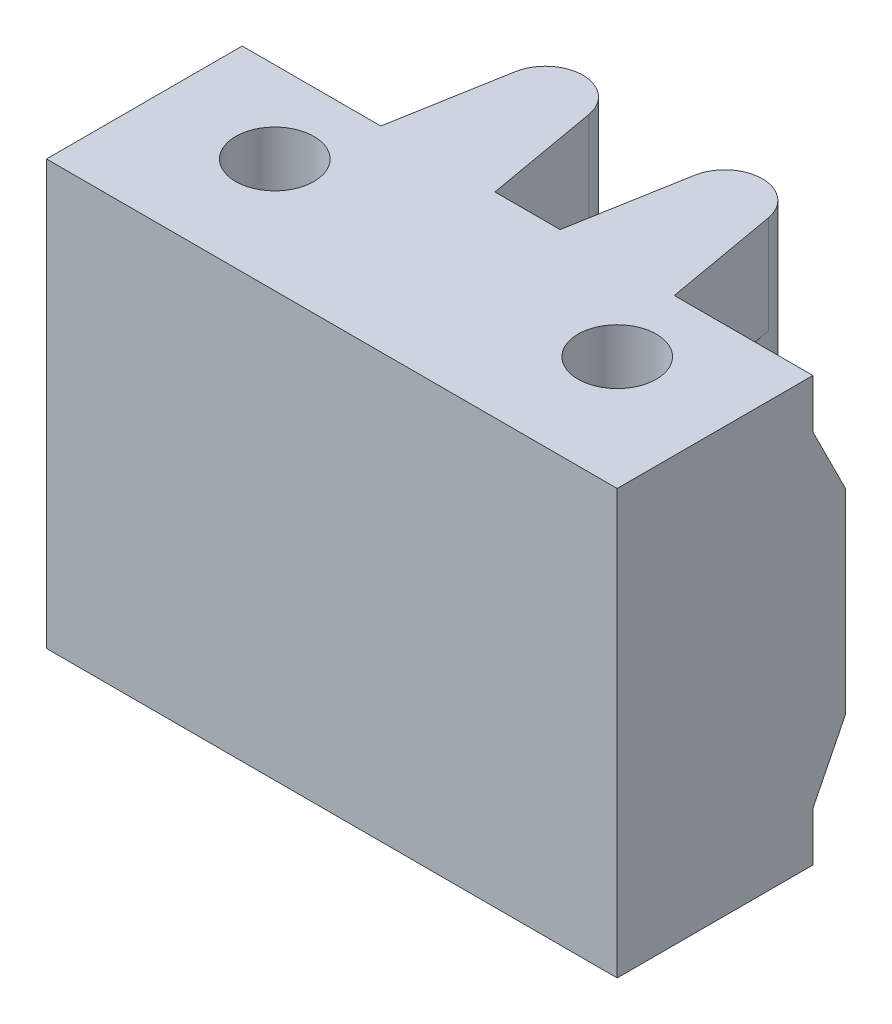
ISO-10303-21;
HEADER;
FILE_DESCRIPTION(('STEP AP214'),'2;1');
FILE_NAME('part.step','',(''),(''),'','','');
FILE_SCHEMA(('AUTOMOTIVE_DESIGN { 1 0 10303 214 1 1 1 1 }'));
ENDSEC;
DATA;
#1=APPLICATION_CONTEXT('core data for automotive mechanical design processes');
#2=APPLICATION_PROTOCOL_DEFINITION('international standard','automotive_design',2000,#1);
#3=PRODUCT_CONTEXT('',#1,'mechanical');
#4=PRODUCT('Part','Part','',(#3));
#5=PRODUCT_RELATED_PRODUCT_CATEGORY('part','',(#4));
#6=PRODUCT_DEFINITION_FORMATION('','',#4);
#7=PRODUCT_DEFINITION_CONTEXT('part definition',#1,'design');
#8=PRODUCT_DEFINITION('design','',#6,#7);
#9=PRODUCT_DEFINITION_SHAPE('','',#8);
#10=(LENGTH_UNIT() NAMED_UNIT(*) SI_UNIT(.MILLI.,.METRE.));
#11=(NAMED_UNIT(*) PLANE_ANGLE_UNIT() SI_UNIT($,.RADIAN.));
#12=(NAMED_UNIT(*) SI_UNIT($,.STERADIAN.) SOLID_ANGLE_UNIT());
#13=UNCERTAINTY_MEASURE_WITH_UNIT(LENGTH_MEASURE(1.E-05),#10,'distance_accuracy_value','');
#14=(GEOMETRIC_REPRESENTATION_CONTEXT(3) GLOBAL_UNCERTAINTY_ASSIGNED_CONTEXT((#13)) GLOBAL_UNIT_ASSIGNED_CONTEXT((#10,
#11,#12)) REPRESENTATION_CONTEXT('',''));
#15=CARTESIAN_POINT('',(0.,0.,0.));
#16=DIRECTION('',(0.,0.,1.));
#17=DIRECTION('',(1.,0.,0.));
#18=AXIS2_PLACEMENT_3D('',#15,#16,#17);
#19=CARTESIAN_POINT('',(0.,0.,0.));
#20=DIRECTION('',(0.,0.,1.));
#21=DIRECTION('',(1.,0.,0.));
#22=AXIS2_PLACEMENT_3D('',#19,#20,#21);
#23=PLANE('',#22);
#24=DIRECTION('',(1.,0.,0.));
#25=VECTOR('',#24,1.);
#26=CARTESIAN_POINT('',(-3.,11.5,0.));
#27=LINE('',#26,#25);
#28=CARTESIAN_POINT('',(-3.,11.5,0.));
#29=VERTEX_POINT('',#28);
#30=CARTESIAN_POINT('',(0.,11.5,0.));
#31=VERTEX_POINT('',#30);
#32=EDGE_CURVE('E240',#29,#31,#27,.T.);
#33=ORIENTED_EDGE('',*,*,#32,.F.);
#34=DIRECTION('',(0.,1.,0.));
#35=VECTOR('',#34,1.);
#36=CARTESIAN_POINT('',(-3.,11.5,0.));
#37=LINE('',#36,#35);
#38=CARTESIAN_POINT('',(-3.,1.5,0.));
#39=VERTEX_POINT('',#38);
#40=EDGE_CURVE('E225',#39,#29,#37,.T.);
#41=ORIENTED_EDGE('',*,*,#40,.F.);
#42=DIRECTION('',(1.,0.,0.));
#43=VECTOR('',#42,1.);
#44=CARTESIAN_POINT('',(-3.,1.5,0.));
#45=LINE('',#44,#43);
#46=CARTESIAN_POINT('',(0.,1.5,0.));
#47=VERTEX_POINT('',#46);
#48=EDGE_CURVE('E250',#39,#47,#45,.T.);
#49=ORIENTED_EDGE('',*,*,#48,.T.);
#50=DIRECTION('',(0.,1.,0.));
#51=VECTOR('',#50,1.);
#52=CARTESIAN_POINT('',(0.,13.,0.));
#53=LINE('',#52,#51);
#54=CARTESIAN_POINT('',(0.,0.,0.));
#55=VERTEX_POINT('',#54);
#56=EDGE_CURVE('E474',#55,#47,#53,.T.);
#57=ORIENTED_EDGE('',*,*,#56,.F.);
#58=DIRECTION('',(1.,0.,0.));
#59=VECTOR('',#58,1.);
#60=CARTESIAN_POINT('',(-17.5,0.,0.));
#61=LINE('',#60,#59);
#62=CARTESIAN_POINT('',(-4.25,0.,0.));
#63=VERTEX_POINT('',#62);
#64=EDGE_CURVE('E468',#63,#55,#61,.T.);
#65=ORIENTED_EDGE('',*,*,#64,.F.);
#66=DIRECTION('',(0.,-1.,0.));
#67=VECTOR('',#66,1.);
#68=CARTESIAN_POINT('',(-4.25,3.,0.));
#69=LINE('',#68,#67);
#70=CARTESIAN_POINT('',(-4.25,3.,0.));
#71=VERTEX_POINT('',#70);
#72=EDGE_CURVE('E333',#71,#63,#69,.T.);
#73=ORIENTED_EDGE('',*,*,#72,.F.);
#74=DIRECTION('',(1.,0.,0.));
#75=VECTOR('',#74,1.);
#76=CARTESIAN_POINT('',(-4.25,3.,0.));
#77=LINE('',#76,#75);
#78=CARTESIAN_POINT('',(-7.75,3.,0.));
#79=VERTEX_POINT('',#78);
#80=EDGE_CURVE('E308',#79,#71,#77,.T.);
#81=ORIENTED_EDGE('',*,*,#80,.F.);
#82=DIRECTION('',(0.,-1.,0.));
#83=VECTOR('',#82,1.);
#84=CARTESIAN_POINT('',(-7.75,3.,0.));
#85=LINE('',#84,#83);
#86=CARTESIAN_POINT('',(-7.75,0.,0.));
#87=VERTEX_POINT('',#86);
#88=EDGE_CURVE('E329',#79,#87,#85,.T.);
#89=ORIENTED_EDGE('',*,*,#88,.T.);
#90=CARTESIAN_POINT('',(-9.75,0.,0.));
#91=VERTEX_POINT('',#90);
#92=EDGE_CURVE('E473',#91,#87,#61,.T.);
#93=ORIENTED_EDGE('',*,*,#92,.F.);
#94=DIRECTION('',(0.,-1.,0.));
#95=VECTOR('',#94,1.);
#96=CARTESIAN_POINT('',(-9.75,3.,0.));
#97=LINE('',#96,#95);
#98=CARTESIAN_POINT('',(-9.75,3.,0.));
#99=VERTEX_POINT('',#98);
#100=EDGE_CURVE('E368',#99,#91,#97,.T.);
#101=ORIENTED_EDGE('',*,*,#100,.F.);
#102=DIRECTION('',(1.,0.,0.));
#103=VECTOR('',#102,1.);
#104=CARTESIAN_POINT('',(-13.25,3.,0.));
#105=LINE('',#104,#103);
#106=CARTESIAN_POINT('',(-13.25,3.,0.));
#107=VERTEX_POINT('',#106);
#108=EDGE_CURVE('E343',#107,#99,#105,.T.);
#109=ORIENTED_EDGE('',*,*,#108,.F.);
#110=DIRECTION('',(0.,-1.,0.));
#111=VECTOR('',#110,1.);
#112=CARTESIAN_POINT('',(-13.25,3.,0.));
#113=LINE('',#112,#111);
#114=CARTESIAN_POINT('',(-13.25,0.,0.));
#115=VERTEX_POINT('',#114);
#116=EDGE_CURVE('E364',#107,#115,#113,.T.);
#117=ORIENTED_EDGE('',*,*,#116,.T.);
#118=CARTESIAN_POINT('',(-17.5,0.,0.));
#119=VERTEX_POINT('',#118);
#120=EDGE_CURVE('E469',#119,#115,#61,.T.);
#121=ORIENTED_EDGE('',*,*,#120,.F.);
#122=DIRECTION('',(0.,-1.,0.));
#123=VECTOR('',#122,1.);
#124=CARTESIAN_POINT('',(-17.5,13.,0.));
#125=LINE('',#124,#123);
#126=CARTESIAN_POINT('',(-17.5,1.5,0.));
#127=VERTEX_POINT('',#126);
#128=EDGE_CURVE('E439',#127,#119,#125,.T.);
#129=ORIENTED_EDGE('',*,*,#128,.F.);
#130=DIRECTION('',(-1.,0.,0.));
#131=VECTOR('',#130,1.);
#132=CARTESIAN_POINT('',(-14.5,1.5,0.));
#133=LINE('',#132,#131);
#134=CARTESIAN_POINT('',(-14.5,1.5,0.));
#135=VERTEX_POINT('',#134);
#136=EDGE_CURVE('E290',#135,#127,#133,.T.);
#137=ORIENTED_EDGE('',*,*,#136,.F.);
#138=DIRECTION('',(0.,1.,0.));
#139=VECTOR('',#138,1.);
#140=CARTESIAN_POINT('',(-14.5,11.5,0.));
#141=LINE('',#140,#139);
#142=CARTESIAN_POINT('',(-14.5,11.5,0.));
#143=VERTEX_POINT('',#142);
#144=EDGE_CURVE('E271',#135,#143,#141,.T.);
#145=ORIENTED_EDGE('',*,*,#144,.T.);
#146=DIRECTION('',(-1.,0.,0.));
#147=VECTOR('',#146,1.);
#148=CARTESIAN_POINT('',(-14.5,11.5,0.));
#149=LINE('',#148,#147);
#150=CARTESIAN_POINT('',(-17.5,11.5,0.));
#151=VERTEX_POINT('',#150);
#152=EDGE_CURVE('E285',#143,#151,#149,.T.);
#153=ORIENTED_EDGE('',*,*,#152,.T.);
#154=CARTESIAN_POINT('',(-17.5,13.,0.));
#155=VERTEX_POINT('',#154);
#156=EDGE_CURVE('E464',#155,#151,#125,.T.);
#157=ORIENTED_EDGE('',*,*,#156,.F.);
#158=DIRECTION('',(-1.,0.,0.));
#159=VECTOR('',#158,1.);
#160=CARTESIAN_POINT('',(-17.5,13.,0.));
#161=LINE('',#160,#159);
#162=CARTESIAN_POINT('',(-13.25,13.,0.));
#163=VERTEX_POINT('',#162);
#164=EDGE_CURVE('E478',#163,#155,#161,.T.);
#165=ORIENTED_EDGE('',*,*,#164,.F.);
#166=DIRECTION('',(0.,1.,0.));
#167=VECTOR('',#166,1.);
#168=CARTESIAN_POINT('',(-13.25,10.,0.));
#169=LINE('',#168,#167);
#170=CARTESIAN_POINT('',(-13.25,10.,0.));
#171=VERTEX_POINT('',#170);
#172=EDGE_CURVE('E444',#171,#163,#169,.T.);
#173=ORIENTED_EDGE('',*,*,#172,.F.);
#174=DIRECTION('',(1.,0.,0.));
#175=VECTOR('',#174,1.);
#176=CARTESIAN_POINT('',(-13.25,10.,0.));
#177=LINE('',#176,#175);
#178=CARTESIAN_POINT('',(-9.75,10.,0.));
#179=VERTEX_POINT('',#178);
#180=EDGE_CURVE('E416',#171,#179,#177,.T.);
#181=ORIENTED_EDGE('',*,*,#180,.T.);
#182=DIRECTION('',(0.,1.,0.));
#183=VECTOR('',#182,1.);
#184=CARTESIAN_POINT('',(-9.75,10.,0.));
#185=LINE('',#184,#183);
#186=CARTESIAN_POINT('',(-9.75,13.,0.));
#187=VERTEX_POINT('',#186);
#188=EDGE_CURVE('E440',#179,#187,#185,.T.);
#189=ORIENTED_EDGE('',*,*,#188,.T.);
#190=CARTESIAN_POINT('',(-7.75,13.,0.));
#191=VERTEX_POINT('',#190);
#192=EDGE_CURVE('E482',#191,#187,#161,.T.);
#193=ORIENTED_EDGE('',*,*,#192,.F.);
#194=DIRECTION('',(0.,1.,0.));
#195=VECTOR('',#194,1.);
#196=CARTESIAN_POINT('',(-7.75,10.,0.));
#197=LINE('',#196,#195);
#198=CARTESIAN_POINT('',(-7.75,10.,0.));
#199=VERTEX_POINT('',#198);
#200=EDGE_CURVE('E406',#199,#191,#197,.T.);
#201=ORIENTED_EDGE('',*,*,#200,.F.);
#202=DIRECTION('',(1.,0.,0.));
#203=VECTOR('',#202,1.);
#204=CARTESIAN_POINT('',(-4.25,10.,0.));
#205=LINE('',#204,#203);
#206=CARTESIAN_POINT('',(-4.25,10.,0.));
#207=VERTEX_POINT('',#206);
#208=EDGE_CURVE('E379',#199,#207,#205,.T.);
#209=ORIENTED_EDGE('',*,*,#208,.T.);
#210=DIRECTION('',(0.,1.,0.));
#211=VECTOR('',#210,1.);
#212=CARTESIAN_POINT('',(-4.25,10.,0.));
#213=LINE('',#212,#211);
#214=CARTESIAN_POINT('',(-4.25,13.,0.));
#215=VERTEX_POINT('',#214);
#216=EDGE_CURVE('E402',#207,#215,#213,.T.);
#217=ORIENTED_EDGE('',*,*,#216,.T.);
#218=CARTESIAN_POINT('',(0.,13.,0.));
#219=VERTEX_POINT('',#218);
#220=EDGE_CURVE('E454',#219,#215,#161,.T.);
#221=ORIENTED_EDGE('',*,*,#220,.F.);
#222=EDGE_CURVE('E248',#31,#219,#53,.T.);
#223=ORIENTED_EDGE('',*,*,#222,.F.);
#224=EDGE_LOOP('',(#33,#41,#49,#57,#65,#73,#81,#89,#93,#101,#109,#117,#121,#129,#137,#145,#153,
#157,#165,#173,#181,#189,#193,#201,#209,#217,#221,#223));
#225=FACE_BOUND('',#224,.T.);
#226=ADVANCED_FACE('F39',(#225),#23,.F.);
#227=CARTESIAN_POINT('',(-6.00000000000001,10.,-3.30024699820035));
#228=DIRECTION('',(0.,-1.,0.));
#229=DIRECTION('',(0.,0.,-1.));
#230=AXIS2_PLACEMENT_3D('',#227,#228,#229);
#231=PLANE('',#230);
#232=DIRECTION('',(-0.173648177666927,0.,0.984807753012209));
#233=VECTOR('',#232,1.);
#234=CARTESIAN_POINT('',(-7.13285556752039,10.,-3.49999999999999));
#235=LINE('',#234,#233);
#236=CARTESIAN_POINT('',(-7.13285556752039,10.,-3.49999999999999));
#237=VERTEX_POINT('',#236);
#238=EDGE_CURVE('E375',#237,#199,#235,.T.);
#239=ORIENTED_EDGE('',*,*,#238,.F.);
#240=CARTESIAN_POINT('',(-6.00000000000001,10.,-3.30024699820035));
#241=DIRECTION('',(0.,1.,0.));
#242=DIRECTION('',(0.,0.,-1.));
#243=AXIS2_PLACEMENT_3D('',#240,#241,#242);
#244=CIRCLE('',#243,1.15033169068311);
#245=CARTESIAN_POINT('',(-4.86714443247964,10.,-3.5));
#246=VERTEX_POINT('',#245);
#247=EDGE_CURVE('E289',#237,#246,#244,.T.);
#248=ORIENTED_EDGE('',*,*,#247,.T.);
#249=DIRECTION('',(-0.173648177666934,0.,-0.984807753012207));
#250=VECTOR('',#249,1.);
#251=CARTESIAN_POINT('',(-4.86714443247964,10.,-3.5));
#252=LINE('',#251,#250);
#253=EDGE_CURVE('E384',#207,#246,#252,.T.);
#254=ORIENTED_EDGE('',*,*,#253,.F.);
#255=ORIENTED_EDGE('',*,*,#208,.F.);
#256=EDGE_LOOP('',(#239,#248,#254,#255));
#257=FACE_BOUND('',#256,.T.);
#258=ADVANCED_FACE('F585',(#257),#231,.T.);
#259=CARTESIAN_POINT('',(-11.5,3.,-3.30024699820035));
#260=DIRECTION('',(0.,-1.,0.));
#261=DIRECTION('',(0.,0.,1.));
#262=AXIS2_PLACEMENT_3D('',#259,#260,#261);
#263=PLANE('',#262);
#264=CARTESIAN_POINT('',(-11.5,3.,-3.30024699820036));
#265=DIRECTION('',(0.,-1.,0.));
#266=DIRECTION('',(0.,0.,-1.));
#267=AXIS2_PLACEMENT_3D('',#264,#265,#266);
#268=CIRCLE('',#267,1.15033169068312);
#269=CARTESIAN_POINT('',(-12.6328555675204,3.,-3.5));
#270=VERTEX_POINT('',#269);
#271=CARTESIAN_POINT('',(-10.3671444324796,3.,-3.49999999999999));
#272=VERTEX_POINT('',#271);
#273=EDGE_CURVE('E48',#270,#272,#268,.F.);
#274=ORIENTED_EDGE('',*,*,#273,.F.);
#275=DIRECTION('',(-0.173648177666934,0.,0.984807753012207));
#276=VECTOR('',#275,1.);
#277=CARTESIAN_POINT('',(-12.6328555675204,3.,-3.5));
#278=LINE('',#277,#276);
#279=EDGE_CURVE('E347',#270,#107,#278,.T.);
#280=ORIENTED_EDGE('',*,*,#279,.T.);
#281=ORIENTED_EDGE('',*,*,#108,.T.);
#282=DIRECTION('',(-0.173648177666927,0.,-0.984807753012209));
#283=VECTOR('',#282,1.);
#284=CARTESIAN_POINT('',(-10.3671444324796,3.,-3.49999999999999));
#285=LINE('',#284,#283);
#286=EDGE_CURVE('E340',#99,#272,#285,.T.);
#287=ORIENTED_EDGE('',*,*,#286,.T.);
#288=EDGE_LOOP('',(#274,#280,#281,#287));
#289=FACE_BOUND('',#288,.T.);
#290=ADVANCED_FACE('F506',(#289),#263,.F.);
#291=CARTESIAN_POINT('',(-17.5,13.,6.));
#292=DIRECTION('',(1.,0.,0.));
#293=DIRECTION('',(0.,0.,-1.));
#294=AXIS2_PLACEMENT_3D('',#291,#292,#293);
#295=PLANE('',#294);
#296=ORIENTED_EDGE('',*,*,#156,.T.);
#297=DIRECTION('',(0.,-0.894427190999916,-0.447213595499958));
#298=VECTOR('',#297,1.);
#299=CARTESIAN_POINT('',(-17.5,9.5,-0.999999999999999));
#300=LINE('',#299,#298);
#301=CARTESIAN_POINT('',(-17.5,9.5,-0.999999999999999));
#302=VERTEX_POINT('',#301);
#303=EDGE_CURVE('E276',#151,#302,#300,.T.);
#304=ORIENTED_EDGE('',*,*,#303,.T.);
#305=DIRECTION('',(0.,-1.,0.));
#306=VECTOR('',#305,1.);
#307=CARTESIAN_POINT('',(-17.5,3.5,-0.999999999999999));
#308=LINE('',#307,#306);
#309=CARTESIAN_POINT('',(-17.5,3.5,-0.999999999999999));
#310=VERTEX_POINT('',#309);
#311=EDGE_CURVE('E280',#302,#310,#308,.T.);
#312=ORIENTED_EDGE('',*,*,#311,.T.);
#313=DIRECTION('',(0.,-0.894427190999916,0.447213595499958));
#314=VECTOR('',#313,1.);
#315=CARTESIAN_POINT('',(-17.5,1.5,0.));
#316=LINE('',#315,#314);
#317=EDGE_CURVE('E63',#310,#127,#316,.T.);
#318=ORIENTED_EDGE('',*,*,#317,.T.);
#319=ORIENTED_EDGE('',*,*,#128,.T.);
#320=DIRECTION('',(0.,0.,-1.));
#321=VECTOR('',#320,1.);
#322=CARTESIAN_POINT('',(-17.5,0.,6.));
#323=LINE('',#322,#321);
#324=CARTESIAN_POINT('',(-17.5,0.,6.));
#325=VERTEX_POINT('',#324);
#326=EDGE_CURVE('E494',#325,#119,#323,.T.);
#327=ORIENTED_EDGE('',*,*,#326,.F.);
#328=DIRECTION('',(0.,-1.,0.));
#329=VECTOR('',#328,1.);
#330=CARTESIAN_POINT('',(-17.5,13.,6.));
#331=LINE('',#330,#329);
#332=CARTESIAN_POINT('',(-17.5,13.,6.));
#333=VERTEX_POINT('',#332);
#334=EDGE_CURVE('E449',#333,#325,#331,.T.);
#335=ORIENTED_EDGE('',*,*,#334,.F.);
#336=DIRECTION('',(0.,0.,-1.));
#337=VECTOR('',#336,1.);
#338=CARTESIAN_POINT('',(-17.5,13.,6.));
#339=LINE('',#338,#337);
#340=EDGE_CURVE('E463',#333,#155,#339,.T.);
#341=ORIENTED_EDGE('',*,*,#340,.T.);
#342=EDGE_LOOP('',(#296,#304,#312,#318,#319,#327,#335,#341));
#343=FACE_BOUND('',#342,.T.);
#344=ADVANCED_FACE('F41',(#343),#295,.F.);
#345=CARTESIAN_POINT('',(-17.5,0.,6.));
#346=DIRECTION('',(0.,1.,0.));
#347=DIRECTION('',(0.,0.,1.));
#348=AXIS2_PLACEMENT_3D('',#345,#346,#347);
#349=PLANE('',#348);
#350=CARTESIAN_POINT('',(-14.,0.,2.5));
#351=DIRECTION('',(0.,1.,0.));
#352=DIRECTION('',(0.,0.,1.));
#353=AXIS2_PLACEMENT_3D('',#350,#351,#352);
#354=CIRCLE('',#353,1.2);
#355=CARTESIAN_POINT('',(-14.,0.,3.7));
#356=VERTEX_POINT('',#355);
#357=EDGE_CURVE('E608',#356,#356,#354,.T.);
#358=ORIENTED_EDGE('',*,*,#357,.T.);
#359=EDGE_LOOP('',(#358));
#360=FACE_BOUND('',#359,.T.);
#361=CARTESIAN_POINT('',(-3.5,0.,2.5));
#362=DIRECTION('',(0.,1.,0.));
#363=DIRECTION('',(0.,0.,1.));
#364=AXIS2_PLACEMENT_3D('',#361,#362,#363);
#365=CIRCLE('',#364,1.2);
#366=CARTESIAN_POINT('',(-3.5,0.,3.7));
#367=VERTEX_POINT('',#366);
#368=EDGE_CURVE('E611',#367,#367,#365,.T.);
#369=ORIENTED_EDGE('',*,*,#368,.T.);
#370=EDGE_LOOP('',(#369));
#371=FACE_BOUND('',#370,.T.);
#372=ORIENTED_EDGE('',*,*,#120,.T.);
#373=DIRECTION('',(-0.173648177666934,0.,0.984807753012207));
#374=VECTOR('',#373,1.);
#375=CARTESIAN_POINT('',(-12.6328555675204,0.,-3.5));
#376=LINE('',#375,#374);
#377=CARTESIAN_POINT('',(-12.6328555675204,0.,-3.5));
#378=VERTEX_POINT('',#377);
#379=EDGE_CURVE('E344',#378,#115,#376,.T.);
#380=ORIENTED_EDGE('',*,*,#379,.F.);
#381=CARTESIAN_POINT('',(-11.5,0.,-3.30024699820035));
#382=DIRECTION('',(0.,1.,0.));
#383=DIRECTION('',(0.,0.,1.));
#384=AXIS2_PLACEMENT_3D('',#381,#382,#383);
#385=CIRCLE('',#384,1.15033169068311);
#386=CARTESIAN_POINT('',(-10.3671444324796,0.,-3.49999999999999));
#387=VERTEX_POINT('',#386);
#388=EDGE_CURVE('E328',#387,#378,#385,.T.);
#389=ORIENTED_EDGE('',*,*,#388,.F.);
#390=DIRECTION('',(-0.173648177666927,0.,-0.984807753012209));
#391=VECTOR('',#390,1.);
#392=CARTESIAN_POINT('',(-10.3671444324796,0.,-3.49999999999999));
#393=LINE('',#392,#391);
#394=EDGE_CURVE('E354',#91,#387,#393,.T.);
#395=ORIENTED_EDGE('',*,*,#394,.F.);
#396=ORIENTED_EDGE('',*,*,#92,.T.);
#397=DIRECTION('',(-0.173648177666927,0.,0.984807753012209));
#398=VECTOR('',#397,1.);
#399=CARTESIAN_POINT('',(-7.13285556752039,0.,-3.49999999999999));
#400=LINE('',#399,#398);
#401=CARTESIAN_POINT('',(-7.13285556752039,0.,-3.49999999999999));
#402=VERTEX_POINT('',#401);
#403=EDGE_CURVE('E309',#402,#87,#400,.T.);
#404=ORIENTED_EDGE('',*,*,#403,.F.);
#405=CARTESIAN_POINT('',(-6.00000000000001,0.,-3.30024699820035));
#406=DIRECTION('',(0.,1.,0.));
#407=DIRECTION('',(0.,0.,-1.));
#408=AXIS2_PLACEMENT_3D('',#405,#406,#407);
#409=CIRCLE('',#408,1.15033169068311);
#410=CARTESIAN_POINT('',(-4.86714443247964,0.,-3.5));
#411=VERTEX_POINT('',#410);
#412=EDGE_CURVE('E303',#411,#402,#409,.T.);
#413=ORIENTED_EDGE('',*,*,#412,.F.);
#414=DIRECTION('',(-0.173648177666934,0.,-0.984807753012207));
#415=VECTOR('',#414,1.);
#416=CARTESIAN_POINT('',(-4.86714443247964,0.,-3.5));
#417=LINE('',#416,#415);
#418=EDGE_CURVE('E319',#63,#411,#417,.T.);
#419=ORIENTED_EDGE('',*,*,#418,.F.);
#420=ORIENTED_EDGE('',*,*,#64,.T.);
#421=DIRECTION('',(0.,0.,-1.));
#422=VECTOR('',#421,1.);
#423=CARTESIAN_POINT('',(0.,0.,6.));
#424=LINE('',#423,#422);
#425=CARTESIAN_POINT('',(0.,0.,6.));
#426=VERTEX_POINT('',#425);
#427=EDGE_CURVE('E490',#426,#55,#424,.T.);
#428=ORIENTED_EDGE('',*,*,#427,.F.);
#429=DIRECTION('',(1.,0.,0.));
#430=VECTOR('',#429,1.);
#431=CARTESIAN_POINT('',(-17.5,0.,6.));
#432=LINE('',#431,#430);
#433=EDGE_CURVE('E453',#325,#426,#432,.T.);
#434=ORIENTED_EDGE('',*,*,#433,.F.);
#435=ORIENTED_EDGE('',*,*,#326,.T.);
#436=EDGE_LOOP('',(#372,#380,#389,#395,#396,#404,#413,#419,#420,#428,#434,#435));
#437=FACE_BOUND('',#436,.T.);
#438=ADVANCED_FACE('F516',(#360,#371,#437),#349,.F.);
#439=CARTESIAN_POINT('',(0.,13.,6.));
#440=DIRECTION('',(-1.,0.,0.));
#441=DIRECTION('',(0.,0.,1.));
#442=AXIS2_PLACEMENT_3D('',#439,#440,#441);
#443=PLANE('',#442);
#444=ORIENTED_EDGE('',*,*,#56,.T.);
#445=DIRECTION('',(0.,-0.894427190999916,0.447213595499958));
#446=VECTOR('',#445,1.);
#447=CARTESIAN_POINT('',(0.,1.5,0.));
#448=LINE('',#447,#446);
#449=CARTESIAN_POINT('',(0.,3.5,-0.999999999999999));
#450=VERTEX_POINT('',#449);
#451=EDGE_CURVE('E536',#450,#47,#448,.T.);
#452=ORIENTED_EDGE('',*,*,#451,.F.);
#453=DIRECTION('',(0.,-1.,0.));
#454=VECTOR('',#453,1.);
#455=CARTESIAN_POINT('',(0.,3.5,-0.999999999999999));
#456=LINE('',#455,#454);
#457=CARTESIAN_POINT('',(0.,9.50000000000001,-0.999999999999999));
#458=VERTEX_POINT('',#457);
#459=EDGE_CURVE('E245',#458,#450,#456,.T.);
#460=ORIENTED_EDGE('',*,*,#459,.F.);
#461=DIRECTION('',(0.,-0.894427190999916,-0.447213595499958));
#462=VECTOR('',#461,1.);
#463=CARTESIAN_POINT('',(0.,9.50000000000001,-0.999999999999999));
#464=LINE('',#463,#462);
#465=EDGE_CURVE('E55',#31,#458,#464,.T.);
#466=ORIENTED_EDGE('',*,*,#465,.F.);
#467=ORIENTED_EDGE('',*,*,#222,.T.);
#468=DIRECTION('',(0.,0.,-1.));
#469=VECTOR('',#468,1.);
#470=CARTESIAN_POINT('',(0.,13.,6.));
#471=LINE('',#470,#469);
#472=CARTESIAN_POINT('',(0.,13.,6.));
#473=VERTEX_POINT('',#472);
#474=EDGE_CURVE('E486',#473,#219,#471,.T.);
#475=ORIENTED_EDGE('',*,*,#474,.F.);
#476=DIRECTION('',(0.,1.,0.));
#477=VECTOR('',#476,1.);
#478=CARTESIAN_POINT('',(0.,13.,6.));
#479=LINE('',#478,#477);
#480=EDGE_CURVE('E457',#426,#473,#479,.T.);
#481=ORIENTED_EDGE('',*,*,#480,.F.);
#482=ORIENTED_EDGE('',*,*,#427,.T.);
#483=EDGE_LOOP('',(#444,#452,#460,#466,#467,#475,#481,#482));
#484=FACE_BOUND('',#483,.T.);
#485=ADVANCED_FACE('F530',(#484),#443,.F.);
#486=CARTESIAN_POINT('',(-17.5,13.,6.));
#487=DIRECTION('',(0.,-1.,0.));
#488=DIRECTION('',(0.,0.,-1.));
#489=AXIS2_PLACEMENT_3D('',#486,#487,#488);
#490=PLANE('',#489);
#491=CARTESIAN_POINT('',(-14.,13.,2.5));
#492=DIRECTION('',(0.,1.,0.));
#493=DIRECTION('',(0.,0.,1.));
#494=AXIS2_PLACEMENT_3D('',#491,#492,#493);
#495=CIRCLE('',#494,1.2);
#496=CARTESIAN_POINT('',(-14.,13.,3.7));
#497=VERTEX_POINT('',#496);
#498=EDGE_CURVE('E624',#497,#497,#495,.T.);
#499=ORIENTED_EDGE('',*,*,#498,.F.);
#500=EDGE_LOOP('',(#499));
#501=FACE_BOUND('',#500,.T.);
#502=CARTESIAN_POINT('',(-3.5,13.,2.5));
#503=DIRECTION('',(0.,1.,0.));
#504=DIRECTION('',(0.,0.,1.));
#505=AXIS2_PLACEMENT_3D('',#502,#503,#504);
#506=CIRCLE('',#505,1.2);
#507=CARTESIAN_POINT('',(-3.5,13.,3.7));
#508=VERTEX_POINT('',#507);
#509=EDGE_CURVE('E632',#508,#508,#506,.T.);
#510=ORIENTED_EDGE('',*,*,#509,.F.);
#511=EDGE_LOOP('',(#510));
#512=FACE_BOUND('',#511,.T.);
#513=ORIENTED_EDGE('',*,*,#220,.T.);
#514=DIRECTION('',(-0.173648177666934,0.,-0.984807753012207));
#515=VECTOR('',#514,1.);
#516=CARTESIAN_POINT('',(-4.86714443247964,13.,-3.5));
#517=LINE('',#516,#515);
#518=CARTESIAN_POINT('',(-4.86714443247964,13.,-3.5));
#519=VERTEX_POINT('',#518);
#520=EDGE_CURVE('E380',#215,#519,#517,.T.);
#521=ORIENTED_EDGE('',*,*,#520,.T.);
#522=CARTESIAN_POINT('',(-6.00000000000001,13.,-3.30024699820035));
#523=DIRECTION('',(0.,1.,0.));
#524=DIRECTION('',(0.,0.,-1.));
#525=AXIS2_PLACEMENT_3D('',#522,#523,#524);
#526=CIRCLE('',#525,1.15033169068311);
#527=CARTESIAN_POINT('',(-7.13285556752039,13.,-3.49999999999999));
#528=VERTEX_POINT('',#527);
#529=EDGE_CURVE('E363',#519,#528,#526,.T.);
#530=ORIENTED_EDGE('',*,*,#529,.T.);
#531=DIRECTION('',(-0.173648177666927,0.,0.984807753012209));
#532=VECTOR('',#531,1.);
#533=CARTESIAN_POINT('',(-7.13285556752039,13.,-3.49999999999999));
#534=LINE('',#533,#532);
#535=EDGE_CURVE('E392',#528,#191,#534,.T.);
#536=ORIENTED_EDGE('',*,*,#535,.T.);
#537=ORIENTED_EDGE('',*,*,#192,.T.);
#538=DIRECTION('',(-0.173648177666927,0.,-0.984807753012209));
#539=VECTOR('',#538,1.);
#540=CARTESIAN_POINT('',(-10.3671444324796,13.,-3.49999999999999));
#541=LINE('',#540,#539);
#542=CARTESIAN_POINT('',(-10.3671444324796,13.,-3.49999999999999));
#543=VERTEX_POINT('',#542);
#544=EDGE_CURVE('E417',#187,#543,#541,.T.);
#545=ORIENTED_EDGE('',*,*,#544,.T.);
#546=CARTESIAN_POINT('',(-11.5,13.,-3.30024699820035));
#547=DIRECTION('',(0.,1.,0.));
#548=DIRECTION('',(0.,0.,1.));
#549=AXIS2_PLACEMENT_3D('',#546,#547,#548);
#550=CIRCLE('',#549,1.15033169068311);
#551=CARTESIAN_POINT('',(-12.6328555675204,13.,-3.5));
#552=VERTEX_POINT('',#551);
#553=EDGE_CURVE('E401',#543,#552,#550,.T.);
#554=ORIENTED_EDGE('',*,*,#553,.T.);
#555=DIRECTION('',(-0.173648177666934,0.,0.984807753012207));
#556=VECTOR('',#555,1.);
#557=CARTESIAN_POINT('',(-12.6328555675204,13.,-3.5));
#558=LINE('',#557,#556);
#559=EDGE_CURVE('E429',#552,#163,#558,.T.);
#560=ORIENTED_EDGE('',*,*,#559,.T.);
#561=ORIENTED_EDGE('',*,*,#164,.T.);
#562=ORIENTED_EDGE('',*,*,#340,.F.);
#563=DIRECTION('',(-1.,0.,0.));
#564=VECTOR('',#563,1.);
#565=CARTESIAN_POINT('',(-17.5,13.,6.));
#566=LINE('',#565,#564);
#567=EDGE_CURVE('E460',#473,#333,#566,.T.);
#568=ORIENTED_EDGE('',*,*,#567,.F.);
#569=ORIENTED_EDGE('',*,*,#474,.T.);
#570=EDGE_LOOP('',(#513,#521,#530,#536,#537,#545,#554,#560,#561,#562,#568,#569));
#571=FACE_BOUND('',#570,.T.);
#572=ADVANCED_FACE('F595',(#501,#512,#571),#490,.F.);
#573=CARTESIAN_POINT('',(0.,0.,6.));
#574=DIRECTION('',(0.,0.,1.));
#575=DIRECTION('',(1.,0.,0.));
#576=AXIS2_PLACEMENT_3D('',#573,#574,#575);
#577=PLANE('',#576);
#578=ORIENTED_EDGE('',*,*,#334,.T.);
#579=ORIENTED_EDGE('',*,*,#433,.T.);
#580=ORIENTED_EDGE('',*,*,#480,.T.);
#581=ORIENTED_EDGE('',*,*,#567,.T.);
#582=EDGE_LOOP('',(#578,#579,#580,#581));
#583=FACE_BOUND('',#582,.T.);
#584=ADVANCED_FACE('F554',(#583),#577,.T.);
#585=CARTESIAN_POINT('',(-11.5,10.,-3.30024699820035));
#586=DIRECTION('',(0.,1.,0.));
#587=DIRECTION('',(0.,0.,1.));
#588=AXIS2_PLACEMENT_3D('',#585,#586,#587);
#589=CYLINDRICAL_SURFACE('',#588,1.15033169068311);
#590=ORIENTED_EDGE('',*,*,#553,.F.);
#591=DIRECTION('',(0.,1.,0.));
#592=VECTOR('',#591,1.);
#593=CARTESIAN_POINT('',(-10.3671444324796,10.,-3.49999999999999));
#594=LINE('',#593,#592);
#595=CARTESIAN_POINT('',(-10.3671444324796,10.,-3.49999999999999));
#596=VERTEX_POINT('',#595);
#597=EDGE_CURVE('E436',#596,#543,#594,.T.);
#598=ORIENTED_EDGE('',*,*,#597,.F.);
#599=CARTESIAN_POINT('',(-11.5,10.,-3.30024699820035));
#600=DIRECTION('',(0.,1.,0.));
#601=DIRECTION('',(0.,0.,1.));
#602=AXIS2_PLACEMENT_3D('',#599,#600,#601);
#603=CIRCLE('',#602,1.15033169068311);
#604=CARTESIAN_POINT('',(-12.6328555675204,10.,-3.5));
#605=VERTEX_POINT('',#604);
#606=EDGE_CURVE('E300',#605,#596,#603,.T.);
#607=ORIENTED_EDGE('',*,*,#606,.F.);
#608=DIRECTION('',(0.,1.,0.));
#609=VECTOR('',#608,1.);
#610=CARTESIAN_POINT('',(-12.6328555675204,10.,-3.5));
#611=LINE('',#610,#609);
#612=EDGE_CURVE('E425',#605,#552,#611,.T.);
#613=ORIENTED_EDGE('',*,*,#612,.T.);
#614=EDGE_LOOP('',(#590,#598,#607,#613));
#615=FACE_BOUND('',#614,.T.);
#616=ORIENTED_EDGE('',*,*,#388,.T.);
#617=DIRECTION('',(0.,-1.,0.));
#618=VECTOR('',#617,1.);
#619=CARTESIAN_POINT('',(-12.6328555675204,3.,-3.5));
#620=LINE('',#619,#618);
#621=EDGE_CURVE('E359',#270,#378,#620,.T.);
#622=ORIENTED_EDGE('',*,*,#621,.F.);
#623=ORIENTED_EDGE('',*,*,#273,.T.);
#624=DIRECTION('',(0.,-1.,0.));
#625=VECTOR('',#624,1.);
#626=CARTESIAN_POINT('',(-10.3671444324796,3.,-3.49999999999999));
#627=LINE('',#626,#625);
#628=EDGE_CURVE('E350',#272,#387,#627,.T.);
#629=ORIENTED_EDGE('',*,*,#628,.T.);
#630=EDGE_LOOP('',(#616,#622,#623,#629));
#631=FACE_BOUND('',#630,.T.);
#632=ADVANCED_FACE('F501',(#615,#631),#589,.T.);
#633=CARTESIAN_POINT('',(-10.3671444324796,10.,-3.49999999999999));
#634=DIRECTION('',(0.984807753012209,0.,-0.173648177666927));
#635=DIRECTION('',(-0.173648177666927,0.,-0.984807753012209));
#636=AXIS2_PLACEMENT_3D('',#633,#634,#635);
#637=PLANE('',#636);
#638=ORIENTED_EDGE('',*,*,#544,.F.);
#639=ORIENTED_EDGE('',*,*,#188,.F.);
#640=DIRECTION('',(-0.173648177666927,0.,-0.984807753012209));
#641=VECTOR('',#640,1.);
#642=CARTESIAN_POINT('',(-10.3671444324796,10.,-3.49999999999999));
#643=LINE('',#642,#641);
#644=EDGE_CURVE('E421',#179,#596,#643,.T.);
#645=ORIENTED_EDGE('',*,*,#644,.T.);
#646=ORIENTED_EDGE('',*,*,#597,.T.);
#647=EDGE_LOOP('',(#638,#639,#645,#646));
#648=FACE_BOUND('',#647,.T.);
#649=ADVANCED_FACE('F830',(#648),#637,.T.);
#650=CARTESIAN_POINT('',(-12.6328555675204,10.,-3.5));
#651=DIRECTION('',(-0.984807753012207,0.,-0.173648177666934));
#652=DIRECTION('',(-0.173648177666934,0.,0.984807753012207));
#653=AXIS2_PLACEMENT_3D('',#650,#651,#652);
#654=PLANE('',#653);
#655=ORIENTED_EDGE('',*,*,#559,.F.);
#656=ORIENTED_EDGE('',*,*,#612,.F.);
#657=DIRECTION('',(-0.173648177666934,0.,0.984807753012207));
#658=VECTOR('',#657,1.);
#659=CARTESIAN_POINT('',(-12.6328555675204,10.,-3.5));
#660=LINE('',#659,#658);
#661=EDGE_CURVE('E412',#605,#171,#660,.T.);
#662=ORIENTED_EDGE('',*,*,#661,.T.);
#663=ORIENTED_EDGE('',*,*,#172,.T.);
#664=EDGE_LOOP('',(#655,#656,#662,#663));
#665=FACE_BOUND('',#664,.T.);
#666=ADVANCED_FACE('F847',(#665),#654,.T.);
#667=CARTESIAN_POINT('',(-11.5,10.,-3.30024699820035));
#668=DIRECTION('',(0.,1.,0.));
#669=DIRECTION('',(0.,0.,1.));
#670=AXIS2_PLACEMENT_3D('',#667,#668,#669);
#671=PLANE('',#670);
#672=ORIENTED_EDGE('',*,*,#606,.T.);
#673=ORIENTED_EDGE('',*,*,#644,.F.);
#674=ORIENTED_EDGE('',*,*,#180,.F.);
#675=ORIENTED_EDGE('',*,*,#661,.F.);
#676=EDGE_LOOP('',(#672,#673,#674,#675));
#677=FACE_BOUND('',#676,.T.);
#678=ADVANCED_FACE('F815',(#677),#671,.F.);
#679=CARTESIAN_POINT('',(-6.00000000000001,10.,-3.30024699820035));
#680=DIRECTION('',(0.,1.,0.));
#681=DIRECTION('',(0.,0.,1.));
#682=AXIS2_PLACEMENT_3D('',#679,#680,#681);
#683=CYLINDRICAL_SURFACE('',#682,1.15033169068311);
#684=ORIENTED_EDGE('',*,*,#529,.F.);
#685=DIRECTION('',(0.,1.,0.));
#686=VECTOR('',#685,1.);
#687=CARTESIAN_POINT('',(-4.86714443247964,10.,-3.5));
#688=LINE('',#687,#686);
#689=EDGE_CURVE('E398',#246,#519,#688,.T.);
#690=ORIENTED_EDGE('',*,*,#689,.F.);
#691=ORIENTED_EDGE('',*,*,#247,.F.);
#692=DIRECTION('',(0.,1.,0.));
#693=VECTOR('',#692,1.);
#694=CARTESIAN_POINT('',(-7.13285556752039,10.,-3.49999999999999));
#695=LINE('',#694,#693);
#696=EDGE_CURVE('E388',#237,#528,#695,.T.);
#697=ORIENTED_EDGE('',*,*,#696,.T.);
#698=EDGE_LOOP('',(#684,#690,#691,#697));
#699=FACE_BOUND('',#698,.T.);
#700=ORIENTED_EDGE('',*,*,#412,.T.);
#701=DIRECTION('',(0.,-1.,0.));
#702=VECTOR('',#701,1.);
#703=CARTESIAN_POINT('',(-7.13285556752039,3.,-3.49999999999999));
#704=LINE('',#703,#702);
#705=CARTESIAN_POINT('',(-7.13285556752039,3.,-3.49999999999999));
#706=VERTEX_POINT('',#705);
#707=EDGE_CURVE('E324',#706,#402,#704,.T.);
#708=ORIENTED_EDGE('',*,*,#707,.F.);
#709=CARTESIAN_POINT('',(-6.00000000000001,3.,-3.30024699820035));
#710=DIRECTION('',(0.,1.,0.));
#711=DIRECTION('',(0.,0.,1.));
#712=AXIS2_PLACEMENT_3D('',#709,#710,#711);
#713=CIRCLE('',#712,1.15033169068311);
#714=CARTESIAN_POINT('',(-4.86714443247964,3.,-3.5));
#715=VERTEX_POINT('',#714);
#716=EDGE_CURVE('E11',#715,#706,#713,.F.);
#717=ORIENTED_EDGE('',*,*,#716,.F.);
#718=DIRECTION('',(0.,-1.,0.));
#719=VECTOR('',#718,1.);
#720=CARTESIAN_POINT('',(-4.86714443247964,3.,-3.5));
#721=LINE('',#720,#719);
#722=EDGE_CURVE('E315',#715,#411,#721,.T.);
#723=ORIENTED_EDGE('',*,*,#722,.T.);
#724=EDGE_LOOP('',(#700,#708,#717,#723));
#725=FACE_BOUND('',#724,.T.);
#726=ADVANCED_FACE('F807',(#699,#725),#683,.T.);
#727=CARTESIAN_POINT('',(-4.86714443247964,10.,-3.5));
#728=DIRECTION('',(0.984807753012207,0.,-0.173648177666934));
#729=DIRECTION('',(-0.173648177666934,0.,-0.984807753012207));
#730=AXIS2_PLACEMENT_3D('',#727,#728,#729);
#731=PLANE('',#730);
#732=ORIENTED_EDGE('',*,*,#520,.F.);
#733=ORIENTED_EDGE('',*,*,#216,.F.);
#734=ORIENTED_EDGE('',*,*,#253,.T.);
#735=ORIENTED_EDGE('',*,*,#689,.T.);
#736=EDGE_LOOP('',(#732,#733,#734,#735));
#737=FACE_BOUND('',#736,.T.);
#738=ADVANCED_FACE('F814',(#737),#731,.T.);
#739=CARTESIAN_POINT('',(-7.13285556752039,10.,-3.49999999999999));
#740=DIRECTION('',(-0.984807753012209,0.,-0.173648177666927));
#741=DIRECTION('',(-0.173648177666927,0.,0.984807753012209));
#742=AXIS2_PLACEMENT_3D('',#739,#740,#741);
#743=PLANE('',#742);
#744=ORIENTED_EDGE('',*,*,#535,.F.);
#745=ORIENTED_EDGE('',*,*,#696,.F.);
#746=ORIENTED_EDGE('',*,*,#238,.T.);
#747=ORIENTED_EDGE('',*,*,#200,.T.);
#748=EDGE_LOOP('',(#744,#745,#746,#747));
#749=FACE_BOUND('',#748,.T.);
#750=ADVANCED_FACE('F869',(#749),#743,.T.);
#751=CARTESIAN_POINT('',(-12.6328555675204,3.,-3.5));
#752=DIRECTION('',(0.984807753012207,0.,0.173648177666934));
#753=DIRECTION('',(0.173648177666934,0.,-0.984807753012207));
#754=AXIS2_PLACEMENT_3D('',#751,#752,#753);
#755=PLANE('',#754);
#756=ORIENTED_EDGE('',*,*,#379,.T.);
#757=ORIENTED_EDGE('',*,*,#116,.F.);
#758=ORIENTED_EDGE('',*,*,#279,.F.);
#759=ORIENTED_EDGE('',*,*,#621,.T.);
#760=EDGE_LOOP('',(#756,#757,#758,#759));
#761=FACE_BOUND('',#760,.T.);
#762=ADVANCED_FACE('F519',(#761),#755,.F.);
#763=CARTESIAN_POINT('',(-10.3671444324796,3.,-3.49999999999999));
#764=DIRECTION('',(-0.984807753012209,0.,0.173648177666927));
#765=DIRECTION('',(0.173648177666927,0.,0.984807753012209));
#766=AXIS2_PLACEMENT_3D('',#763,#764,#765);
#767=PLANE('',#766);
#768=ORIENTED_EDGE('',*,*,#394,.T.);
#769=ORIENTED_EDGE('',*,*,#628,.F.);
#770=ORIENTED_EDGE('',*,*,#286,.F.);
#771=ORIENTED_EDGE('',*,*,#100,.T.);
#772=EDGE_LOOP('',(#768,#769,#770,#771));
#773=FACE_BOUND('',#772,.T.);
#774=ADVANCED_FACE('F512',(#773),#767,.F.);
#775=CARTESIAN_POINT('',(-7.13285556752039,3.,-3.49999999999999));
#776=DIRECTION('',(0.984807753012209,0.,0.173648177666927));
#777=DIRECTION('',(0.173648177666927,0.,-0.984807753012209));
#778=AXIS2_PLACEMENT_3D('',#775,#776,#777);
#779=PLANE('',#778);
#780=ORIENTED_EDGE('',*,*,#403,.T.);
#781=ORIENTED_EDGE('',*,*,#88,.F.);
#782=DIRECTION('',(-0.173648177666927,0.,0.984807753012209));
#783=VECTOR('',#782,1.);
#784=CARTESIAN_POINT('',(-7.13285556752039,3.,-3.49999999999999));
#785=LINE('',#784,#783);
#786=EDGE_CURVE('E312',#706,#79,#785,.T.);
#787=ORIENTED_EDGE('',*,*,#786,.F.);
#788=ORIENTED_EDGE('',*,*,#707,.T.);
#789=EDGE_LOOP('',(#780,#781,#787,#788));
#790=FACE_BOUND('',#789,.T.);
#791=ADVANCED_FACE('F890',(#790),#779,.F.);
#792=CARTESIAN_POINT('',(-4.86714443247964,3.,-3.5));
#793=DIRECTION('',(-0.984807753012207,0.,0.173648177666934));
#794=DIRECTION('',(0.173648177666934,0.,0.984807753012207));
#795=AXIS2_PLACEMENT_3D('',#792,#793,#794);
#796=PLANE('',#795);
#797=ORIENTED_EDGE('',*,*,#418,.T.);
#798=ORIENTED_EDGE('',*,*,#722,.F.);
#799=DIRECTION('',(-0.173648177666934,0.,-0.984807753012207));
#800=VECTOR('',#799,1.);
#801=CARTESIAN_POINT('',(-4.86714443247964,3.,-3.5));
#802=LINE('',#801,#800);
#803=EDGE_CURVE('E304',#71,#715,#802,.T.);
#804=ORIENTED_EDGE('',*,*,#803,.F.);
#805=ORIENTED_EDGE('',*,*,#72,.T.);
#806=EDGE_LOOP('',(#797,#798,#804,#805));
#807=FACE_BOUND('',#806,.T.);
#808=ADVANCED_FACE('F897',(#807),#796,.F.);
#809=CARTESIAN_POINT('',(-6.00000000000001,3.,-3.30024699820035));
#810=DIRECTION('',(0.,1.,0.));
#811=DIRECTION('',(0.,0.,-1.));
#812=AXIS2_PLACEMENT_3D('',#809,#810,#811);
#813=PLANE('',#812);
#814=ORIENTED_EDGE('',*,*,#803,.T.);
#815=ORIENTED_EDGE('',*,*,#716,.T.);
#816=ORIENTED_EDGE('',*,*,#786,.T.);
#817=ORIENTED_EDGE('',*,*,#80,.T.);
#818=EDGE_LOOP('',(#814,#815,#816,#817));
#819=FACE_BOUND('',#818,.T.);
#820=ADVANCED_FACE('F581',(#819),#813,.T.);
#821=CARTESIAN_POINT('',(-14.5,9.5,-0.999999999999999));
#822=DIRECTION('',(0.,0.447213595499958,-0.894427190999916));
#823=DIRECTION('',(0.,0.894427190999916,0.447213595499958));
#824=AXIS2_PLACEMENT_3D('',#821,#822,#823);
#825=PLANE('',#824);
#826=ORIENTED_EDGE('',*,*,#303,.F.);
#827=ORIENTED_EDGE('',*,*,#152,.F.);
#828=DIRECTION('',(0.,-0.894427190999916,-0.447213595499958));
#829=VECTOR('',#828,1.);
#830=CARTESIAN_POINT('',(-14.5,9.5,-0.999999999999999));
#831=LINE('',#830,#829);
#832=CARTESIAN_POINT('',(-14.5,9.5,-0.999999999999999));
#833=VERTEX_POINT('',#832);
#834=EDGE_CURVE('E260',#143,#833,#831,.T.);
#835=ORIENTED_EDGE('',*,*,#834,.T.);
#836=DIRECTION('',(-1.,0.,0.));
#837=VECTOR('',#836,1.);
#838=CARTESIAN_POINT('',(-14.5,9.5,-0.999999999999999));
#839=LINE('',#838,#837);
#840=EDGE_CURVE('E275',#833,#302,#839,.T.);
#841=ORIENTED_EDGE('',*,*,#840,.T.);
#842=EDGE_LOOP('',(#826,#827,#835,#841));
#843=FACE_BOUND('',#842,.T.);
#844=ADVANCED_FACE('F564',(#843),#825,.T.);
#845=CARTESIAN_POINT('',(-14.5,1.5,0.));
#846=DIRECTION('',(0.,-0.447213595499958,-0.894427190999916));
#847=DIRECTION('',(0.,0.894427190999916,-0.447213595499958));
#848=AXIS2_PLACEMENT_3D('',#845,#846,#847);
#849=PLANE('',#848);
#850=ORIENTED_EDGE('',*,*,#317,.F.);
#851=DIRECTION('',(-1.,0.,0.));
#852=VECTOR('',#851,1.);
#853=CARTESIAN_POINT('',(-14.5,3.5,-0.999999999999999));
#854=LINE('',#853,#852);
#855=CARTESIAN_POINT('',(-14.5,3.5,-0.999999999999999));
#856=VERTEX_POINT('',#855);
#857=EDGE_CURVE('E293',#856,#310,#854,.T.);
#858=ORIENTED_EDGE('',*,*,#857,.F.);
#859=DIRECTION('',(0.,-0.894427190999916,0.447213595499958));
#860=VECTOR('',#859,1.);
#861=CARTESIAN_POINT('',(-14.5,1.5,0.));
#862=LINE('',#861,#860);
#863=EDGE_CURVE('E268',#856,#135,#862,.T.);
#864=ORIENTED_EDGE('',*,*,#863,.T.);
#865=ORIENTED_EDGE('',*,*,#136,.T.);
#866=EDGE_LOOP('',(#850,#858,#864,#865));
#867=FACE_BOUND('',#866,.T.);
#868=ADVANCED_FACE('F573',(#867),#849,.T.);
#869=CARTESIAN_POINT('',(-14.5,3.5,-0.999999999999999));
#870=DIRECTION('',(0.,0.,-1.));
#871=DIRECTION('',(-1.,0.,0.));
#872=AXIS2_PLACEMENT_3D('',#869,#870,#871);
#873=PLANE('',#872);
#874=ORIENTED_EDGE('',*,*,#311,.F.);
#875=ORIENTED_EDGE('',*,*,#840,.F.);
#876=DIRECTION('',(0.,-1.,0.));
#877=VECTOR('',#876,1.);
#878=CARTESIAN_POINT('',(-14.5,3.5,-0.999999999999999));
#879=LINE('',#878,#877);
#880=EDGE_CURVE('E264',#833,#856,#879,.T.);
#881=ORIENTED_EDGE('',*,*,#880,.T.);
#882=ORIENTED_EDGE('',*,*,#857,.T.);
#883=EDGE_LOOP('',(#874,#875,#881,#882));
#884=FACE_BOUND('',#883,.T.);
#885=ADVANCED_FACE('F571',(#884),#873,.T.);
#886=CARTESIAN_POINT('',(-14.5,0.,0.));
#887=DIRECTION('',(-1.,0.,0.));
#888=DIRECTION('',(0.,0.,1.));
#889=AXIS2_PLACEMENT_3D('',#886,#887,#888);
#890=PLANE('',#889);
#891=ORIENTED_EDGE('',*,*,#834,.F.);
#892=ORIENTED_EDGE('',*,*,#144,.F.);
#893=ORIENTED_EDGE('',*,*,#863,.F.);
#894=ORIENTED_EDGE('',*,*,#880,.F.);
#895=EDGE_LOOP('',(#891,#892,#893,#894));
#896=FACE_BOUND('',#895,.T.);
#897=ADVANCED_FACE('F567',(#896),#890,.F.);
#898=CARTESIAN_POINT('',(-3.,9.50000000000001,-0.999999999999999));
#899=DIRECTION('',(0.,-0.447213595499958,0.894427190999916));
#900=DIRECTION('',(0.,-0.894427190999916,-0.447213595499958));
#901=AXIS2_PLACEMENT_3D('',#898,#899,#900);
#902=PLANE('',#901);
#903=ORIENTED_EDGE('',*,*,#465,.T.);
#904=DIRECTION('',(1.,0.,0.));
#905=VECTOR('',#904,1.);
#906=CARTESIAN_POINT('',(-3.,9.50000000000001,-0.999999999999999));
#907=LINE('',#906,#905);
#908=CARTESIAN_POINT('',(-3.,9.50000000000001,-0.999999999999999));
#909=VERTEX_POINT('',#908);
#910=EDGE_CURVE('E243',#909,#458,#907,.T.);
#911=ORIENTED_EDGE('',*,*,#910,.F.);
#912=DIRECTION('',(0.,-0.894427190999916,-0.447213595499958));
#913=VECTOR('',#912,1.);
#914=CARTESIAN_POINT('',(-3.,9.50000000000001,-0.999999999999999));
#915=LINE('',#914,#913);
#916=EDGE_CURVE('E228',#29,#909,#915,.T.);
#917=ORIENTED_EDGE('',*,*,#916,.F.);
#918=ORIENTED_EDGE('',*,*,#32,.T.);
#919=EDGE_LOOP('',(#903,#911,#917,#918));
#920=FACE_BOUND('',#919,.T.);
#921=ADVANCED_FACE('F239',(#920),#902,.F.);
#922=CARTESIAN_POINT('',(-3.,3.5,-0.999999999999999));
#923=DIRECTION('',(0.,0.,1.));
#924=DIRECTION('',(1.,0.,0.));
#925=AXIS2_PLACEMENT_3D('',#922,#923,#924);
#926=PLANE('',#925);
#927=ORIENTED_EDGE('',*,*,#459,.T.);
#928=DIRECTION('',(1.,0.,0.));
#929=VECTOR('',#928,1.);
#930=CARTESIAN_POINT('',(-3.,3.5,-0.999999999999999));
#931=LINE('',#930,#929);
#932=CARTESIAN_POINT('',(-3.,3.5,-0.999999999999999));
#933=VERTEX_POINT('',#932);
#934=EDGE_CURVE('E255',#933,#450,#931,.T.);
#935=ORIENTED_EDGE('',*,*,#934,.F.);
#936=DIRECTION('',(0.,-1.,0.));
#937=VECTOR('',#936,1.);
#938=CARTESIAN_POINT('',(-3.,3.5,-0.999999999999999));
#939=LINE('',#938,#937);
#940=EDGE_CURVE('E251',#909,#933,#939,.T.);
#941=ORIENTED_EDGE('',*,*,#940,.F.);
#942=ORIENTED_EDGE('',*,*,#910,.T.);
#943=EDGE_LOOP('',(#927,#935,#941,#942));
#944=FACE_BOUND('',#943,.T.);
#945=ADVANCED_FACE('F683',(#944),#926,.F.);
#946=CARTESIAN_POINT('',(-3.,1.5,0.));
#947=DIRECTION('',(0.,0.447213595499958,0.894427190999916));
#948=DIRECTION('',(0.,-0.894427190999916,0.447213595499958));
#949=AXIS2_PLACEMENT_3D('',#946,#947,#948);
#950=PLANE('',#949);
#951=ORIENTED_EDGE('',*,*,#451,.T.);
#952=ORIENTED_EDGE('',*,*,#48,.F.);
#953=DIRECTION('',(0.,-0.894427190999916,0.447213595499958));
#954=VECTOR('',#953,1.);
#955=CARTESIAN_POINT('',(-3.,1.5,0.));
#956=LINE('',#955,#954);
#957=EDGE_CURVE('E231',#933,#39,#956,.T.);
#958=ORIENTED_EDGE('',*,*,#957,.F.);
#959=ORIENTED_EDGE('',*,*,#934,.T.);
#960=EDGE_LOOP('',(#951,#952,#958,#959));
#961=FACE_BOUND('',#960,.T.);
#962=ADVANCED_FACE('F534',(#961),#950,.F.);
#963=CARTESIAN_POINT('',(-3.,0.,0.));
#964=DIRECTION('',(1.,0.,0.));
#965=DIRECTION('',(0.,0.,1.));
#966=AXIS2_PLACEMENT_3D('',#963,#964,#965);
#967=PLANE('',#966);
#968=ORIENTED_EDGE('',*,*,#916,.T.);
#969=ORIENTED_EDGE('',*,*,#940,.T.);
#970=ORIENTED_EDGE('',*,*,#957,.T.);
#971=ORIENTED_EDGE('',*,*,#40,.T.);
#972=EDGE_LOOP('',(#968,#969,#970,#971));
#973=FACE_BOUND('',#972,.T.);
#974=ADVANCED_FACE('F227',(#973),#967,.F.);
#975=CARTESIAN_POINT('',(-3.5,8.,2.5));
#976=DIRECTION('',(0.,1.,0.));
#977=DIRECTION('',(0.,0.,1.));
#978=AXIS2_PLACEMENT_3D('',#975,#976,#977);
#979=CYLINDRICAL_SURFACE('',#978,1.2);
#980=CARTESIAN_POINT('',(-3.5,8.,2.5));
#981=DIRECTION('',(0.,1.,0.));
#982=DIRECTION('',(0.,0.,1.));
#983=AXIS2_PLACEMENT_3D('',#980,#981,#982);
#984=CIRCLE('',#983,1.2);
#985=CARTESIAN_POINT('',(-3.5,8.,3.7));
#986=VERTEX_POINT('',#985);
#987=EDGE_CURVE('E628',#986,#986,#984,.T.);
#988=ORIENTED_EDGE('',*,*,#987,.F.);
#989=EDGE_LOOP('',(#988));
#990=FACE_BOUND('',#989,.T.);
#991=ORIENTED_EDGE('',*,*,#509,.T.);
#992=EDGE_LOOP('',(#991));
#993=FACE_BOUND('',#992,.T.);
#994=ADVANCED_FACE('F676',(#990,#993),#979,.F.);
#995=CARTESIAN_POINT('',(-3.5,8.,2.5));
#996=DIRECTION('',(0.,1.,0.));
#997=DIRECTION('',(0.,0.,1.));
#998=AXIS2_PLACEMENT_3D('',#995,#996,#997);
#999=PLANE('',#998);
#1000=ORIENTED_EDGE('',*,*,#987,.T.);
#1001=EDGE_LOOP('',(#1000));
#1002=FACE_BOUND('',#1001,.T.);
#1003=ADVANCED_FACE('F672',(#1002),#999,.T.);
#1004=CARTESIAN_POINT('',(-14.,8.,2.5));
#1005=DIRECTION('',(0.,1.,0.));
#1006=DIRECTION('',(0.,0.,1.));
#1007=AXIS2_PLACEMENT_3D('',#1004,#1005,#1006);
#1008=CYLINDRICAL_SURFACE('',#1007,1.2);
#1009=CARTESIAN_POINT('',(-14.,8.,2.5));
#1010=DIRECTION('',(0.,1.,0.));
#1011=DIRECTION('',(0.,0.,1.));
#1012=AXIS2_PLACEMENT_3D('',#1009,#1010,#1011);
#1013=CIRCLE('',#1012,1.2);
#1014=CARTESIAN_POINT('',(-14.,8.,3.7));
#1015=VERTEX_POINT('',#1014);
#1016=EDGE_CURVE('E543',#1015,#1015,#1013,.T.);
#1017=ORIENTED_EDGE('',*,*,#1016,.F.);
#1018=EDGE_LOOP('',(#1017));
#1019=FACE_BOUND('',#1018,.T.);
#1020=ORIENTED_EDGE('',*,*,#498,.T.);
#1021=EDGE_LOOP('',(#1020));
#1022=FACE_BOUND('',#1021,.T.);
#1023=ADVANCED_FACE('F668',(#1019,#1022),#1008,.F.);
#1024=CARTESIAN_POINT('',(-14.,8.,2.5));
#1025=DIRECTION('',(0.,1.,0.));
#1026=DIRECTION('',(0.,0.,1.));
#1027=AXIS2_PLACEMENT_3D('',#1024,#1025,#1026);
#1028=PLANE('',#1027);
#1029=ORIENTED_EDGE('',*,*,#1016,.T.);
#1030=EDGE_LOOP('',(#1029));
#1031=FACE_BOUND('',#1030,.T.);
#1032=ADVANCED_FACE('F664',(#1031),#1028,.T.);
#1033=CARTESIAN_POINT('',(-3.5,5.,2.5));
#1034=DIRECTION('',(0.,-1.,0.));
#1035=DIRECTION('',(0.,0.,-1.));
#1036=AXIS2_PLACEMENT_3D('',#1033,#1034,#1035);
#1037=CYLINDRICAL_SURFACE('',#1036,1.2);
#1038=CARTESIAN_POINT('',(-3.5,5.,2.5));
#1039=DIRECTION('',(0.,1.,0.));
#1040=DIRECTION('',(0.,0.,1.));
#1041=AXIS2_PLACEMENT_3D('',#1038,#1039,#1040);
#1042=CIRCLE('',#1041,1.2);
#1043=CARTESIAN_POINT('',(-3.5,5.,3.7));
#1044=VERTEX_POINT('',#1043);
#1045=EDGE_CURVE('E614',#1044,#1044,#1042,.T.);
#1046=ORIENTED_EDGE('',*,*,#1045,.T.);
#1047=EDGE_LOOP('',(#1046));
#1048=FACE_BOUND('',#1047,.T.);
#1049=ORIENTED_EDGE('',*,*,#368,.F.);
#1050=EDGE_LOOP('',(#1049));
#1051=FACE_BOUND('',#1050,.T.);
#1052=ADVANCED_FACE('F660',(#1048,#1051),#1037,.F.);
#1053=CARTESIAN_POINT('',(-3.5,5.,2.5));
#1054=DIRECTION('',(0.,-1.,0.));
#1055=DIRECTION('',(0.,0.,1.));
#1056=AXIS2_PLACEMENT_3D('',#1053,#1054,#1055);
#1057=PLANE('',#1056);
#1058=ORIENTED_EDGE('',*,*,#1045,.F.);
#1059=EDGE_LOOP('',(#1058));
#1060=FACE_BOUND('',#1059,.T.);
#1061=ADVANCED_FACE('F655',(#1060),#1057,.T.);
#1062=CARTESIAN_POINT('',(-14.,5.,2.5));
#1063=DIRECTION('',(0.,-1.,0.));
#1064=DIRECTION('',(0.,0.,-1.));
#1065=AXIS2_PLACEMENT_3D('',#1062,#1063,#1064);
#1066=CYLINDRICAL_SURFACE('',#1065,1.2);
#1067=CARTESIAN_POINT('',(-14.,5.,2.5));
#1068=DIRECTION('',(0.,1.,0.));
#1069=DIRECTION('',(0.,0.,1.));
#1070=AXIS2_PLACEMENT_3D('',#1067,#1068,#1069);
#1071=CIRCLE('',#1070,1.2);
#1072=CARTESIAN_POINT('',(-14.,5.,3.7));
#1073=VERTEX_POINT('',#1072);
#1074=EDGE_CURVE('E635',#1073,#1073,#1071,.T.);
#1075=ORIENTED_EDGE('',*,*,#1074,.T.);
#1076=EDGE_LOOP('',(#1075));
#1077=FACE_BOUND('',#1076,.T.);
#1078=ORIENTED_EDGE('',*,*,#357,.F.);
#1079=EDGE_LOOP('',(#1078));
#1080=FACE_BOUND('',#1079,.T.);
#1081=ADVANCED_FACE('F646',(#1077,#1080),#1066,.F.);
#1082=CARTESIAN_POINT('',(-14.,5.,2.5));
#1083=DIRECTION('',(0.,-1.,0.));
#1084=DIRECTION('',(0.,0.,1.));
#1085=AXIS2_PLACEMENT_3D('',#1082,#1083,#1084);
#1086=PLANE('',#1085);
#1087=ORIENTED_EDGE('',*,*,#1074,.F.);
#1088=EDGE_LOOP('',(#1087));
#1089=FACE_BOUND('',#1088,.T.);
#1090=ADVANCED_FACE('F649',(#1089),#1086,.T.);
#1091=CLOSED_SHELL('',(#226,#258,#290,#344,#438,#485,#572,#584,#632,#649,#666,#678,#726,#738,
#750,#762,#774,#791,#808,#820,#844,#868,#885,#897,#921,#945,#962,#974,#994,#1003,#1023,#1032,
#1052,#1061,#1081,#1090));
#1092=MANIFOLD_SOLID_BREP('B2',#1091);
#1093=ADVANCED_BREP_SHAPE_REPRESENTATION('',(#18,#1092),#14);
#1094=SHAPE_DEFINITION_REPRESENTATION(#9,#1093);
ENDSEC;
END-ISO-10303-21;
